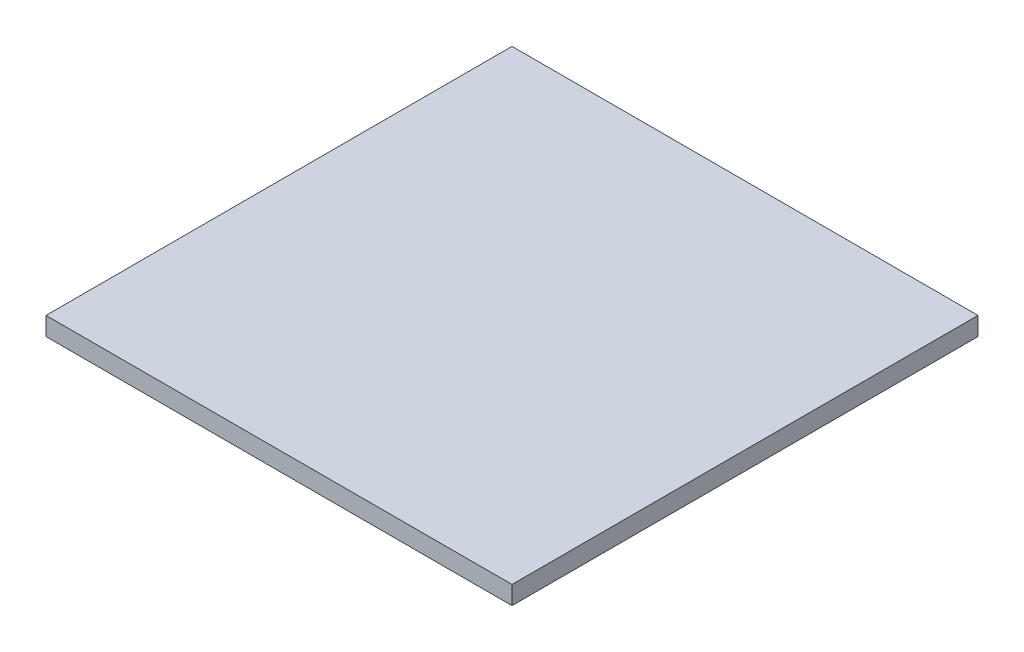
ISO-10303-21;
HEADER;
FILE_DESCRIPTION(('STEP AP214'),'2;1');
FILE_NAME('part.step','',(''),(''),'','','');
FILE_SCHEMA(('AUTOMOTIVE_DESIGN { 1 0 10303 214 1 1 1 1 }'));
ENDSEC;
DATA;
#1=APPLICATION_CONTEXT('core data for automotive mechanical design processes');
#2=APPLICATION_PROTOCOL_DEFINITION('international standard','automotive_design',2000,#1);
#3=PRODUCT_CONTEXT('',#1,'mechanical');
#4=PRODUCT('Part','Part','',(#3));
#5=PRODUCT_RELATED_PRODUCT_CATEGORY('part','',(#4));
#6=PRODUCT_DEFINITION_FORMATION('','',#4);
#7=PRODUCT_DEFINITION_CONTEXT('part definition',#1,'design');
#8=PRODUCT_DEFINITION('design','',#6,#7);
#9=PRODUCT_DEFINITION_SHAPE('','',#8);
#10=(LENGTH_UNIT() NAMED_UNIT(*) SI_UNIT(.MILLI.,.METRE.));
#11=(NAMED_UNIT(*) PLANE_ANGLE_UNIT() SI_UNIT($,.RADIAN.));
#12=(NAMED_UNIT(*) SI_UNIT($,.STERADIAN.) SOLID_ANGLE_UNIT());
#13=UNCERTAINTY_MEASURE_WITH_UNIT(LENGTH_MEASURE(1.E-05),#10,'distance_accuracy_value','');
#14=(GEOMETRIC_REPRESENTATION_CONTEXT(3) GLOBAL_UNCERTAINTY_ASSIGNED_CONTEXT((#13)) GLOBAL_UNIT_ASSIGNED_CONTEXT((#10,
#11,#12)) REPRESENTATION_CONTEXT('',''));
#15=CARTESIAN_POINT('',(0.,0.,0.));
#16=DIRECTION('',(0.,0.,1.));
#17=DIRECTION('',(1.,0.,0.));
#18=AXIS2_PLACEMENT_3D('',#15,#16,#17);
#19=CARTESIAN_POINT('',(0.,0.5,0.));
#20=DIRECTION('',(1.,0.,0.));
#21=DIRECTION('',(0.,0.,-1.));
#22=AXIS2_PLACEMENT_3D('',#19,#20,#21);
#23=PLANE('',#22);
#24=DIRECTION('',(0.,0.,1.));
#25=VECTOR('',#24,1.);
#26=CARTESIAN_POINT('',(0.,0.,0.));
#27=LINE('',#26,#25);
#28=CARTESIAN_POINT('',(0.,0.,-12.7));
#29=VERTEX_POINT('',#28);
#30=CARTESIAN_POINT('',(0.,0.,0.));
#31=VERTEX_POINT('',#30);
#32=EDGE_CURVE('E96',#29,#31,#27,.T.);
#33=ORIENTED_EDGE('',*,*,#32,.T.);
#34=DIRECTION('',(0.,-1.,0.));
#35=VECTOR('',#34,1.);
#36=CARTESIAN_POINT('',(0.,0.5,0.));
#37=LINE('',#36,#35);
#38=CARTESIAN_POINT('',(0.,0.5,0.));
#39=VERTEX_POINT('',#38);
#40=EDGE_CURVE('E11',#39,#31,#37,.T.);
#41=ORIENTED_EDGE('',*,*,#40,.F.);
#42=DIRECTION('',(0.,0.,1.));
#43=VECTOR('',#42,1.);
#44=CARTESIAN_POINT('',(0.,0.5,0.));
#45=LINE('',#44,#43);
#46=CARTESIAN_POINT('',(0.,0.5,-12.7));
#47=VERTEX_POINT('',#46);
#48=EDGE_CURVE('E84',#47,#39,#45,.T.);
#49=ORIENTED_EDGE('',*,*,#48,.F.);
#50=DIRECTION('',(0.,-1.,0.));
#51=VECTOR('',#50,1.);
#52=CARTESIAN_POINT('',(0.,0.5,-12.7));
#53=LINE('',#52,#51);
#54=EDGE_CURVE('E92',#47,#29,#53,.T.);
#55=ORIENTED_EDGE('',*,*,#54,.T.);
#56=EDGE_LOOP('',(#33,#41,#49,#55));
#57=FACE_BOUND('',#56,.T.);
#58=ADVANCED_FACE('F33',(#57),#23,.F.);
#59=CARTESIAN_POINT('',(0.,0.5,0.));
#60=DIRECTION('',(0.,0.,-1.));
#61=DIRECTION('',(-1.,0.,0.));
#62=AXIS2_PLACEMENT_3D('',#59,#60,#61);
#63=PLANE('',#62);
#64=DIRECTION('',(1.,0.,0.));
#65=VECTOR('',#64,1.);
#66=CARTESIAN_POINT('',(0.,0.,0.));
#67=LINE('',#66,#65);
#68=CARTESIAN_POINT('',(12.7,0.,0.));
#69=VERTEX_POINT('',#68);
#70=EDGE_CURVE('E88',#31,#69,#67,.T.);
#71=ORIENTED_EDGE('',*,*,#70,.T.);
#72=DIRECTION('',(0.,-1.,0.));
#73=VECTOR('',#72,1.);
#74=CARTESIAN_POINT('',(12.7,0.5,0.));
#75=LINE('',#74,#73);
#76=CARTESIAN_POINT('',(12.7,0.5,0.));
#77=VERTEX_POINT('',#76);
#78=EDGE_CURVE('E41',#77,#69,#75,.T.);
#79=ORIENTED_EDGE('',*,*,#78,.F.);
#80=DIRECTION('',(1.,0.,0.));
#81=VECTOR('',#80,1.);
#82=CARTESIAN_POINT('',(0.,0.5,0.));
#83=LINE('',#82,#81);
#84=EDGE_CURVE('E79',#39,#77,#83,.T.);
#85=ORIENTED_EDGE('',*,*,#84,.F.);
#86=ORIENTED_EDGE('',*,*,#40,.T.);
#87=EDGE_LOOP('',(#71,#79,#85,#86));
#88=FACE_BOUND('',#87,.T.);
#89=ADVANCED_FACE('F87',(#88),#63,.F.);
#90=CARTESIAN_POINT('',(12.7,0.5,0.));
#91=DIRECTION('',(-1.,0.,0.));
#92=DIRECTION('',(0.,0.,1.));
#93=AXIS2_PLACEMENT_3D('',#90,#91,#92);
#94=PLANE('',#93);
#95=DIRECTION('',(0.,0.,-1.));
#96=VECTOR('',#95,1.);
#97=CARTESIAN_POINT('',(12.7,0.,0.));
#98=LINE('',#97,#96);
#99=CARTESIAN_POINT('',(12.7,0.,-12.7));
#100=VERTEX_POINT('',#99);
#101=EDGE_CURVE('E66',#69,#100,#98,.T.);
#102=ORIENTED_EDGE('',*,*,#101,.T.);
#103=DIRECTION('',(0.,-1.,0.));
#104=VECTOR('',#103,1.);
#105=CARTESIAN_POINT('',(12.7,0.5,-12.7));
#106=LINE('',#105,#104);
#107=CARTESIAN_POINT('',(12.7,0.5,-12.7));
#108=VERTEX_POINT('',#107);
#109=EDGE_CURVE('E89',#108,#100,#106,.T.);
#110=ORIENTED_EDGE('',*,*,#109,.F.);
#111=DIRECTION('',(0.,0.,-1.));
#112=VECTOR('',#111,1.);
#113=CARTESIAN_POINT('',(12.7,0.5,0.));
#114=LINE('',#113,#112);
#115=EDGE_CURVE('E82',#77,#108,#114,.T.);
#116=ORIENTED_EDGE('',*,*,#115,.F.);
#117=ORIENTED_EDGE('',*,*,#78,.T.);
#118=EDGE_LOOP('',(#102,#110,#116,#117));
#119=FACE_BOUND('',#118,.T.);
#120=ADVANCED_FACE('F90',(#119),#94,.F.);
#121=CARTESIAN_POINT('',(0.,0.5,-12.7));
#122=DIRECTION('',(0.,0.,1.));
#123=DIRECTION('',(1.,0.,0.));
#124=AXIS2_PLACEMENT_3D('',#121,#122,#123);
#125=PLANE('',#124);
#126=DIRECTION('',(-1.,0.,0.));
#127=VECTOR('',#126,1.);
#128=CARTESIAN_POINT('',(0.,0.,-12.7));
#129=LINE('',#128,#127);
#130=EDGE_CURVE('E72',#100,#29,#129,.T.);
#131=ORIENTED_EDGE('',*,*,#130,.T.);
#132=ORIENTED_EDGE('',*,*,#54,.F.);
#133=DIRECTION('',(-1.,0.,0.));
#134=VECTOR('',#133,1.);
#135=CARTESIAN_POINT('',(0.,0.5,-12.7));
#136=LINE('',#135,#134);
#137=EDGE_CURVE('E49',#108,#47,#136,.T.);
#138=ORIENTED_EDGE('',*,*,#137,.F.);
#139=ORIENTED_EDGE('',*,*,#109,.T.);
#140=EDGE_LOOP('',(#131,#132,#138,#139));
#141=FACE_BOUND('',#140,.T.);
#142=ADVANCED_FACE('F103',(#141),#125,.F.);
#143=CARTESIAN_POINT('',(0.,0.5,0.));
#144=DIRECTION('',(0.,-1.,0.));
#145=DIRECTION('',(0.,0.,-1.));
#146=AXIS2_PLACEMENT_3D('',#143,#144,#145);
#147=PLANE('',#146);
#148=ORIENTED_EDGE('',*,*,#48,.T.);
#149=ORIENTED_EDGE('',*,*,#84,.T.);
#150=ORIENTED_EDGE('',*,*,#115,.T.);
#151=ORIENTED_EDGE('',*,*,#137,.T.);
#152=EDGE_LOOP('',(#148,#149,#150,#151));
#153=FACE_BOUND('',#152,.T.);
#154=ADVANCED_FACE('F80',(#153),#147,.F.);
#155=CARTESIAN_POINT('',(0.,0.,0.));
#156=DIRECTION('',(0.,-1.,0.));
#157=DIRECTION('',(0.,0.,-1.));
#158=AXIS2_PLACEMENT_3D('',#155,#156,#157);
#159=PLANE('',#158);
#160=ORIENTED_EDGE('',*,*,#32,.F.);
#161=ORIENTED_EDGE('',*,*,#130,.F.);
#162=ORIENTED_EDGE('',*,*,#101,.F.);
#163=ORIENTED_EDGE('',*,*,#70,.F.);
#164=EDGE_LOOP('',(#160,#161,#162,#163));
#165=FACE_BOUND('',#164,.T.);
#166=ADVANCED_FACE('F106',(#165),#159,.T.);
#167=CLOSED_SHELL('',(#58,#89,#120,#142,#154,#166));
#168=MANIFOLD_SOLID_BREP('B2',#167);
#169=ADVANCED_BREP_SHAPE_REPRESENTATION('',(#18,#168),#14);
#170=SHAPE_DEFINITION_REPRESENTATION(#9,#169);
ENDSEC;
END-ISO-10303-21;
